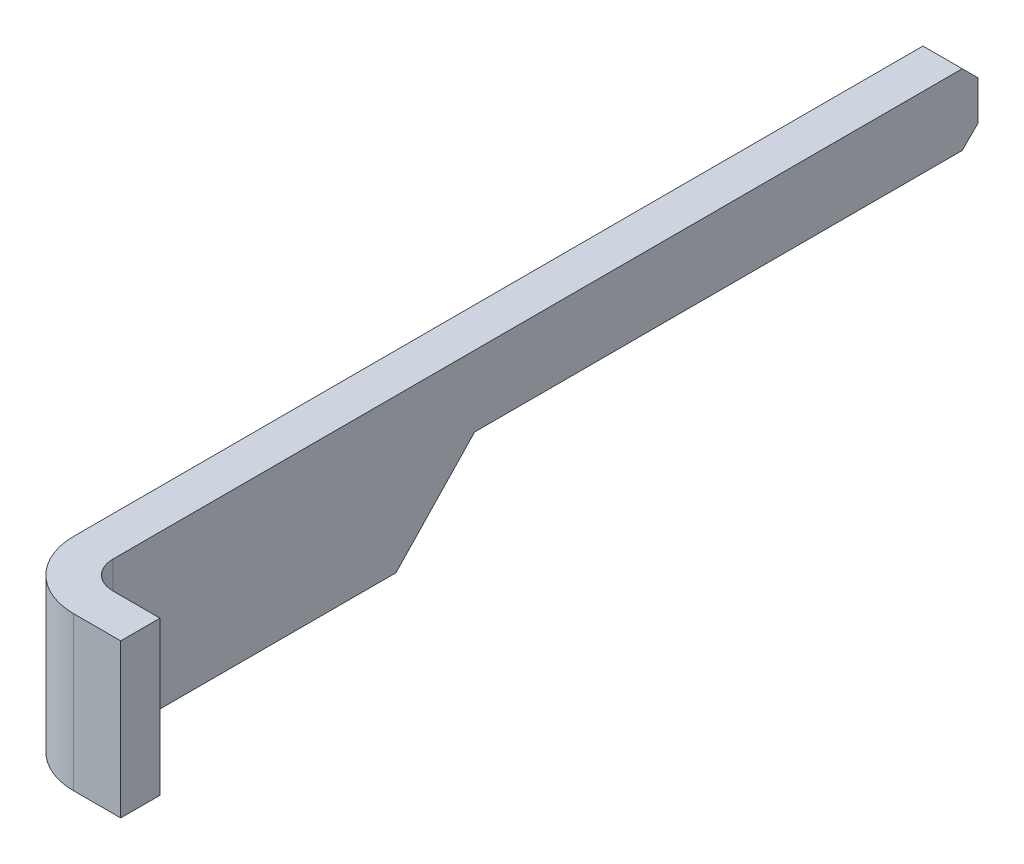
ISO-10303-21;
HEADER;
FILE_DESCRIPTION(('STEP AP214'),'2;1');
FILE_NAME('part.step','',(''),(''),'','','');
FILE_SCHEMA(('AUTOMOTIVE_DESIGN { 1 0 10303 214 1 1 1 1 }'));
ENDSEC;
DATA;
#1=APPLICATION_CONTEXT('core data for automotive mechanical design processes');
#2=APPLICATION_PROTOCOL_DEFINITION('international standard','automotive_design',2000,#1);
#3=PRODUCT_CONTEXT('',#1,'mechanical');
#4=PRODUCT('Part','Part','',(#3));
#5=PRODUCT_RELATED_PRODUCT_CATEGORY('part','',(#4));
#6=PRODUCT_DEFINITION_FORMATION('','',#4);
#7=PRODUCT_DEFINITION_CONTEXT('part definition',#1,'design');
#8=PRODUCT_DEFINITION('design','',#6,#7);
#9=PRODUCT_DEFINITION_SHAPE('','',#8);
#10=(LENGTH_UNIT() NAMED_UNIT(*) SI_UNIT(.MILLI.,.METRE.));
#11=(NAMED_UNIT(*) PLANE_ANGLE_UNIT() SI_UNIT($,.RADIAN.));
#12=(NAMED_UNIT(*) SI_UNIT($,.STERADIAN.) SOLID_ANGLE_UNIT());
#13=UNCERTAINTY_MEASURE_WITH_UNIT(LENGTH_MEASURE(1.E-05),#10,'distance_accuracy_value','');
#14=(GEOMETRIC_REPRESENTATION_CONTEXT(3) GLOBAL_UNCERTAINTY_ASSIGNED_CONTEXT((#13)) GLOBAL_UNIT_ASSIGNED_CONTEXT((#10,
#11,#12)) REPRESENTATION_CONTEXT('',''));
#15=CARTESIAN_POINT('',(0.,0.,0.));
#16=DIRECTION('',(0.,0.,1.));
#17=DIRECTION('',(1.,0.,0.));
#18=AXIS2_PLACEMENT_3D('',#15,#16,#17);
#19=CARTESIAN_POINT('',(-3.925,4.54308339506894,2.3));
#20=DIRECTION('',(-1.,0.,0.));
#21=DIRECTION('',(0.,1.,0.));
#22=AXIS2_PLACEMENT_3D('',#19,#20,#21);
#23=PLANE('',#22);
#24=DIRECTION('',(0.,0.,-1.));
#25=VECTOR('',#24,1.);
#26=CARTESIAN_POINT('',(-3.925,4.01808339506894,0.));
#27=LINE('',#26,#25);
#28=CARTESIAN_POINT('',(-3.925,4.01808339506894,2.3));
#29=VERTEX_POINT('',#28);
#30=CARTESIAN_POINT('',(-3.925,4.01808339506894,-3.1));
#31=VERTEX_POINT('',#30);
#32=EDGE_CURVE('E11',#29,#31,#27,.T.);
#33=ORIENTED_EDGE('',*,*,#32,.T.);
#34=DIRECTION('',(0.,-0.707106781186546,-0.707106781186549));
#35=VECTOR('',#34,1.);
#36=CARTESIAN_POINT('',(-3.925,4.01808339506894,-3.1));
#37=LINE('',#36,#35);
#38=CARTESIAN_POINT('',(-3.925,3.91808339506894,-3.2));
#39=VERTEX_POINT('',#38);
#40=EDGE_CURVE('E24',#31,#39,#37,.T.);
#41=ORIENTED_EDGE('',*,*,#40,.T.);
#42=DIRECTION('',(0.,-1.,0.));
#43=VECTOR('',#42,1.);
#44=CARTESIAN_POINT('',(-3.925,4.54308339506894,-3.2));
#45=LINE('',#44,#43);
#46=CARTESIAN_POINT('',(-3.925,3.66808339506894,-3.2));
#47=VERTEX_POINT('',#46);
#48=EDGE_CURVE('E186',#39,#47,#45,.T.);
#49=ORIENTED_EDGE('',*,*,#48,.T.);
#50=DIRECTION('',(0.,-0.707106781186548,0.707106781186548));
#51=VECTOR('',#50,1.);
#52=CARTESIAN_POINT('',(-3.925,3.66808339506894,-3.2));
#53=LINE('',#52,#51);
#54=CARTESIAN_POINT('',(-3.925,3.56808339506894,-3.1));
#55=VERTEX_POINT('',#54);
#56=EDGE_CURVE('E184',#47,#55,#53,.T.);
#57=ORIENTED_EDGE('',*,*,#56,.T.);
#58=DIRECTION('',(0.,0.,1.));
#59=VECTOR('',#58,1.);
#60=CARTESIAN_POINT('',(-3.925,3.56808339506894,0.));
#61=LINE('',#60,#59);
#62=CARTESIAN_POINT('',(-3.925,3.56808339506894,0.));
#63=VERTEX_POINT('',#62);
#64=EDGE_CURVE('E182',#55,#63,#61,.T.);
#65=ORIENTED_EDGE('',*,*,#64,.T.);
#66=DIRECTION('',(0.,-0.724137931034481,0.689655172413795));
#67=VECTOR('',#66,1.);
#68=CARTESIAN_POINT('',(-3.925,3.56808339506894,0.));
#69=LINE('',#68,#67);
#70=CARTESIAN_POINT('',(-3.925,3.04308339506894,0.5));
#71=VERTEX_POINT('',#70);
#72=EDGE_CURVE('E180',#63,#71,#69,.T.);
#73=ORIENTED_EDGE('',*,*,#72,.T.);
#74=DIRECTION('',(0.,0.,-1.));
#75=VECTOR('',#74,1.);
#76=CARTESIAN_POINT('',(-3.925,3.04308339506894,2.3));
#77=LINE('',#76,#75);
#78=CARTESIAN_POINT('',(-3.925,3.04308339506894,2.3));
#79=VERTEX_POINT('',#78);
#80=EDGE_CURVE('E177',#79,#71,#77,.T.);
#81=ORIENTED_EDGE('',*,*,#80,.F.);
#82=DIRECTION('',(0.,-1.,0.));
#83=VECTOR('',#82,1.);
#84=CARTESIAN_POINT('',(-3.925,4.54308339506894,2.3));
#85=LINE('',#84,#83);
#86=EDGE_CURVE('E174',#29,#79,#85,.T.);
#87=ORIENTED_EDGE('',*,*,#86,.F.);
#88=EDGE_LOOP('',(#33,#41,#49,#57,#65,#73,#81,#87));
#89=FACE_BOUND('',#88,.T.);
#90=ADVANCED_FACE('F17',(#89),#23,.T.);
#91=CARTESIAN_POINT('',(-3.675,4.54308339506894,2.3));
#92=DIRECTION('',(1.,0.,0.));
#93=DIRECTION('',(0.,0.,1.));
#94=AXIS2_PLACEMENT_3D('',#91,#92,#93);
#95=PLANE('',#94);
#96=DIRECTION('',(0.,1.,0.));
#97=VECTOR('',#96,1.);
#98=CARTESIAN_POINT('',(-3.675,4.54308339506894,2.3));
#99=LINE('',#98,#97);
#100=CARTESIAN_POINT('',(-3.675,3.04308339506894,2.3));
#101=VERTEX_POINT('',#100);
#102=CARTESIAN_POINT('',(-3.675,4.01808339506894,2.3));
#103=VERTEX_POINT('',#102);
#104=EDGE_CURVE('E172',#101,#103,#99,.T.);
#105=ORIENTED_EDGE('',*,*,#104,.F.);
#106=DIRECTION('',(0.,0.,-1.));
#107=VECTOR('',#106,1.);
#108=CARTESIAN_POINT('',(-3.675,3.04308339506894,2.3));
#109=LINE('',#108,#107);
#110=CARTESIAN_POINT('',(-3.675,3.04308339506894,0.5));
#111=VERTEX_POINT('',#110);
#112=EDGE_CURVE('E170',#101,#111,#109,.T.);
#113=ORIENTED_EDGE('',*,*,#112,.T.);
#114=DIRECTION('',(0.,0.724137931034481,-0.689655172413795));
#115=VECTOR('',#114,1.);
#116=CARTESIAN_POINT('',(-3.675,2.93071716439117,0.607015457788352));
#117=LINE('',#116,#115);
#118=CARTESIAN_POINT('',(-3.675,3.56808339506894,0.));
#119=VERTEX_POINT('',#118);
#120=EDGE_CURVE('E168',#111,#119,#117,.T.);
#121=ORIENTED_EDGE('',*,*,#120,.T.);
#122=DIRECTION('',(0.,0.,-1.));
#123=VECTOR('',#122,1.);
#124=CARTESIAN_POINT('',(-3.675,3.56808339506894,2.3));
#125=LINE('',#124,#123);
#126=CARTESIAN_POINT('',(-3.675,3.56808339506894,-3.1));
#127=VERTEX_POINT('',#126);
#128=EDGE_CURVE('E166',#119,#127,#125,.T.);
#129=ORIENTED_EDGE('',*,*,#128,.T.);
#130=DIRECTION('',(0.,0.707106781186548,-0.707106781186548));
#131=VECTOR('',#130,1.);
#132=CARTESIAN_POINT('',(-3.675,1.35558339506894,-0.887500000000001));
#133=LINE('',#132,#131);
#134=CARTESIAN_POINT('',(-3.675,3.66808339506894,-3.2));
#135=VERTEX_POINT('',#134);
#136=EDGE_CURVE('E164',#127,#135,#133,.T.);
#137=ORIENTED_EDGE('',*,*,#136,.T.);
#138=DIRECTION('',(0.,1.,0.));
#139=VECTOR('',#138,1.);
#140=CARTESIAN_POINT('',(-3.675,4.54308339506894,-3.2));
#141=LINE('',#140,#139);
#142=CARTESIAN_POINT('',(-3.675,3.91808339506894,-3.2));
#143=VERTEX_POINT('',#142);
#144=EDGE_CURVE('E162',#135,#143,#141,.T.);
#145=ORIENTED_EDGE('',*,*,#144,.T.);
#146=DIRECTION('',(0.,0.707106781186546,0.707106781186549));
#147=VECTOR('',#146,1.);
#148=CARTESIAN_POINT('',(-3.675,6.98058339506894,-0.137499999999986));
#149=LINE('',#148,#147);
#150=CARTESIAN_POINT('',(-3.675,4.01808339506894,-3.1));
#151=VERTEX_POINT('',#150);
#152=EDGE_CURVE('E160',#143,#151,#149,.T.);
#153=ORIENTED_EDGE('',*,*,#152,.T.);
#154=DIRECTION('',(0.,0.,1.));
#155=VECTOR('',#154,1.);
#156=CARTESIAN_POINT('',(-3.675,4.01808339506894,2.3));
#157=LINE('',#156,#155);
#158=EDGE_CURVE('E157',#151,#103,#157,.T.);
#159=ORIENTED_EDGE('',*,*,#158,.T.);
#160=EDGE_LOOP('',(#105,#113,#121,#129,#137,#145,#153,#159));
#161=FACE_BOUND('',#160,.T.);
#162=ADVANCED_FACE('F247',(#161),#95,.T.);
#163=CARTESIAN_POINT('',(-3.5,4.7,2.3));
#164=DIRECTION('',(0.,1.,0.));
#165=DIRECTION('',(0.,0.,1.));
#166=AXIS2_PLACEMENT_3D('',#163,#164,#165);
#167=CYLINDRICAL_SURFACE('',#166,0.425000000000003);
#168=ORIENTED_EDGE('',*,*,#86,.T.);
#169=CARTESIAN_POINT('',(-3.5,3.04308339506894,2.3));
#170=DIRECTION('',(0.,-1.,0.));
#171=DIRECTION('',(0.,0.,1.));
#172=AXIS2_PLACEMENT_3D('',#169,#170,#171);
#173=CIRCLE('',#172,0.425000000000002);
#174=CARTESIAN_POINT('',(-3.5,3.04308339506894,2.725));
#175=VERTEX_POINT('',#174);
#176=EDGE_CURVE('E154',#175,#79,#173,.T.);
#177=ORIENTED_EDGE('',*,*,#176,.F.);
#178=DIRECTION('',(0.,-1.,0.));
#179=VECTOR('',#178,1.);
#180=CARTESIAN_POINT('',(-3.5,4.54308339506894,2.725));
#181=LINE('',#180,#179);
#182=CARTESIAN_POINT('',(-3.5,4.01808339506894,2.725));
#183=VERTEX_POINT('',#182);
#184=EDGE_CURVE('E109',#183,#175,#181,.T.);
#185=ORIENTED_EDGE('',*,*,#184,.F.);
#186=CARTESIAN_POINT('',(-3.5,4.01808339506894,2.3));
#187=DIRECTION('',(0.,1.,0.));
#188=DIRECTION('',(0.,0.,1.));
#189=AXIS2_PLACEMENT_3D('',#186,#187,#188);
#190=CIRCLE('',#189,0.425000000000003);
#191=EDGE_CURVE('E151',#29,#183,#190,.T.);
#192=ORIENTED_EDGE('',*,*,#191,.F.);
#193=EDGE_LOOP('',(#168,#177,#185,#192));
#194=FACE_BOUND('',#193,.T.);
#195=ADVANCED_FACE('F230',(#194),#167,.T.);
#196=CARTESIAN_POINT('',(-3.5,4.7,2.3));
#197=DIRECTION('',(0.,1.,0.));
#198=DIRECTION('',(0.,0.,1.));
#199=AXIS2_PLACEMENT_3D('',#196,#197,#198);
#200=CYLINDRICAL_SURFACE('',#199,0.175000000000002);
#201=DIRECTION('',(0.,1.,0.));
#202=VECTOR('',#201,1.);
#203=CARTESIAN_POINT('',(-3.5,4.54308339506894,2.475));
#204=LINE('',#203,#202);
#205=CARTESIAN_POINT('',(-3.5,3.04308339506894,2.475));
#206=VERTEX_POINT('',#205);
#207=CARTESIAN_POINT('',(-3.5,4.01808339506894,2.475));
#208=VERTEX_POINT('',#207);
#209=EDGE_CURVE('E148',#206,#208,#204,.T.);
#210=ORIENTED_EDGE('',*,*,#209,.F.);
#211=CARTESIAN_POINT('',(-3.5,3.04308339506894,2.3));
#212=DIRECTION('',(0.,-1.,0.));
#213=DIRECTION('',(0.,0.,1.));
#214=AXIS2_PLACEMENT_3D('',#211,#212,#213);
#215=CIRCLE('',#214,0.175000000000002);
#216=EDGE_CURVE('E145',#206,#101,#215,.T.);
#217=ORIENTED_EDGE('',*,*,#216,.T.);
#218=ORIENTED_EDGE('',*,*,#104,.T.);
#219=CARTESIAN_POINT('',(-3.5,4.01808339506894,2.3));
#220=DIRECTION('',(0.,-1.,0.));
#221=DIRECTION('',(0.,0.,1.));
#222=AXIS2_PLACEMENT_3D('',#219,#220,#221);
#223=CIRCLE('',#222,0.175000000000002);
#224=EDGE_CURVE('E142',#208,#103,#223,.T.);
#225=ORIENTED_EDGE('',*,*,#224,.F.);
#226=EDGE_LOOP('',(#210,#217,#218,#225));
#227=FACE_BOUND('',#226,.T.);
#228=ADVANCED_FACE('F222',(#227),#200,.F.);
#229=CARTESIAN_POINT('',(-3.5,4.54308339506894,2.475));
#230=DIRECTION('',(0.,0.,1.));
#231=DIRECTION('',(-1.,0.,0.));
#232=AXIS2_PLACEMENT_3D('',#229,#230,#231);
#233=PLANE('',#232);
#234=DIRECTION('',(1.,0.,0.));
#235=VECTOR('',#234,1.);
#236=CARTESIAN_POINT('',(-3.5,4.01808339506894,2.475));
#237=LINE('',#236,#235);
#238=CARTESIAN_POINT('',(-3.2,4.01808339506894,2.475));
#239=VERTEX_POINT('',#238);
#240=EDGE_CURVE('E140',#208,#239,#237,.T.);
#241=ORIENTED_EDGE('',*,*,#240,.T.);
#242=DIRECTION('',(0.,1.,0.));
#243=VECTOR('',#242,1.);
#244=CARTESIAN_POINT('',(-3.2,4.54308339506894,2.475));
#245=LINE('',#244,#243);
#246=CARTESIAN_POINT('',(-3.2,3.04308339506894,2.475));
#247=VERTEX_POINT('',#246);
#248=EDGE_CURVE('E138',#247,#239,#245,.T.);
#249=ORIENTED_EDGE('',*,*,#248,.F.);
#250=DIRECTION('',(1.,0.,0.));
#251=VECTOR('',#250,1.);
#252=CARTESIAN_POINT('',(-3.5,3.04308339506894,2.475));
#253=LINE('',#252,#251);
#254=EDGE_CURVE('E127',#206,#247,#253,.T.);
#255=ORIENTED_EDGE('',*,*,#254,.F.);
#256=ORIENTED_EDGE('',*,*,#209,.T.);
#257=EDGE_LOOP('',(#241,#249,#255,#256));
#258=FACE_BOUND('',#257,.T.);
#259=ADVANCED_FACE('F225',(#258),#233,.F.);
#260=CARTESIAN_POINT('',(-3.5,4.54308339506894,2.725));
#261=DIRECTION('',(0.,0.,-1.));
#262=DIRECTION('',(0.,1.,0.));
#263=AXIS2_PLACEMENT_3D('',#260,#261,#262);
#264=PLANE('',#263);
#265=DIRECTION('',(-1.,0.,0.));
#266=VECTOR('',#265,1.);
#267=CARTESIAN_POINT('',(-3.5,4.01808339506894,2.725));
#268=LINE('',#267,#266);
#269=CARTESIAN_POINT('',(-3.2,4.01808339506894,2.725));
#270=VERTEX_POINT('',#269);
#271=EDGE_CURVE('E114',#270,#183,#268,.T.);
#272=ORIENTED_EDGE('',*,*,#271,.T.);
#273=ORIENTED_EDGE('',*,*,#184,.T.);
#274=DIRECTION('',(1.,0.,0.));
#275=VECTOR('',#274,1.);
#276=CARTESIAN_POINT('',(-3.5,3.04308339506894,2.725));
#277=LINE('',#276,#275);
#278=CARTESIAN_POINT('',(-3.2,3.04308339506894,2.725));
#279=VERTEX_POINT('',#278);
#280=EDGE_CURVE('E103',#175,#279,#277,.T.);
#281=ORIENTED_EDGE('',*,*,#280,.T.);
#282=DIRECTION('',(0.,-1.,0.));
#283=VECTOR('',#282,1.);
#284=CARTESIAN_POINT('',(-3.2,4.54308339506894,2.725));
#285=LINE('',#284,#283);
#286=EDGE_CURVE('E107',#270,#279,#285,.T.);
#287=ORIENTED_EDGE('',*,*,#286,.F.);
#288=EDGE_LOOP('',(#272,#273,#281,#287));
#289=FACE_BOUND('',#288,.T.);
#290=ADVANCED_FACE('F106',(#289),#264,.F.);
#291=CARTESIAN_POINT('',(-3.2,0.,0.));
#292=DIRECTION('',(-1.,0.,0.));
#293=DIRECTION('',(0.,0.,-1.));
#294=AXIS2_PLACEMENT_3D('',#291,#292,#293);
#295=PLANE('',#294);
#296=DIRECTION('',(0.,0.,1.));
#297=VECTOR('',#296,1.);
#298=CARTESIAN_POINT('',(-3.2,4.01808339506894,0.));
#299=LINE('',#298,#297);
#300=EDGE_CURVE('E122',#239,#270,#299,.T.);
#301=ORIENTED_EDGE('',*,*,#300,.T.);
#302=ORIENTED_EDGE('',*,*,#286,.T.);
#303=DIRECTION('',(0.,0.,-1.));
#304=VECTOR('',#303,1.);
#305=CARTESIAN_POINT('',(-3.2,3.04308339506894,2.725));
#306=LINE('',#305,#304);
#307=EDGE_CURVE('E120',#279,#247,#306,.T.);
#308=ORIENTED_EDGE('',*,*,#307,.T.);
#309=ORIENTED_EDGE('',*,*,#248,.T.);
#310=EDGE_LOOP('',(#301,#302,#308,#309));
#311=FACE_BOUND('',#310,.T.);
#312=ADVANCED_FACE('F118',(#311),#295,.F.);
#313=CARTESIAN_POINT('',(-3.925,3.04308339506894,2.3));
#314=DIRECTION('',(0.,-1.,0.));
#315=DIRECTION('',(0.,0.,-1.));
#316=AXIS2_PLACEMENT_3D('',#313,#314,#315);
#317=PLANE('',#316);
#318=DIRECTION('',(-1.,0.,0.));
#319=VECTOR('',#318,1.);
#320=CARTESIAN_POINT('',(-3.425,3.04308339506894,0.5));
#321=LINE('',#320,#319);
#322=EDGE_CURVE('E128',#111,#71,#321,.T.);
#323=ORIENTED_EDGE('',*,*,#322,.F.);
#324=ORIENTED_EDGE('',*,*,#112,.F.);
#325=DIRECTION('',(1.,0.,0.));
#326=VECTOR('',#325,1.);
#327=CARTESIAN_POINT('',(-3.925,3.04308339506894,2.3));
#328=LINE('',#327,#326);
#329=EDGE_CURVE('E132',#79,#101,#328,.T.);
#330=ORIENTED_EDGE('',*,*,#329,.F.);
#331=ORIENTED_EDGE('',*,*,#80,.T.);
#332=EDGE_LOOP('',(#323,#324,#330,#331));
#333=FACE_BOUND('',#332,.T.);
#334=ADVANCED_FACE('F218',(#333),#317,.T.);
#335=CARTESIAN_POINT('',(-3.5,3.04308339506894,2.725));
#336=DIRECTION('',(0.,-1.,0.));
#337=DIRECTION('',(0.,0.,-1.));
#338=AXIS2_PLACEMENT_3D('',#335,#336,#337);
#339=PLANE('',#338);
#340=DIRECTION('',(0.,0.,-1.));
#341=VECTOR('',#340,1.);
#342=CARTESIAN_POINT('',(-3.5,3.04308339506894,2.725));
#343=LINE('',#342,#341);
#344=EDGE_CURVE('E204',#175,#206,#343,.T.);
#345=ORIENTED_EDGE('',*,*,#344,.F.);
#346=ORIENTED_EDGE('',*,*,#176,.T.);
#347=ORIENTED_EDGE('',*,*,#329,.T.);
#348=ORIENTED_EDGE('',*,*,#216,.F.);
#349=EDGE_LOOP('',(#345,#346,#347,#348));
#350=FACE_BOUND('',#349,.T.);
#351=ADVANCED_FACE('F213',(#350),#339,.T.);
#352=CARTESIAN_POINT('',(-3.5,3.04308339506894,2.725));
#353=DIRECTION('',(0.,1.,0.));
#354=DIRECTION('',(0.,0.,1.));
#355=AXIS2_PLACEMENT_3D('',#352,#353,#354);
#356=PLANE('',#355);
#357=ORIENTED_EDGE('',*,*,#307,.F.);
#358=ORIENTED_EDGE('',*,*,#280,.F.);
#359=ORIENTED_EDGE('',*,*,#344,.T.);
#360=ORIENTED_EDGE('',*,*,#254,.T.);
#361=EDGE_LOOP('',(#357,#358,#359,#360));
#362=FACE_BOUND('',#361,.T.);
#363=ADVANCED_FACE('F125',(#362),#356,.F.);
#364=CARTESIAN_POINT('',(-1.2,0.,-3.2));
#365=DIRECTION('',(0.,0.,-1.));
#366=DIRECTION('',(1.,0.,0.));
#367=AXIS2_PLACEMENT_3D('',#364,#365,#366);
#368=PLANE('',#367);
#369=DIRECTION('',(-1.,0.,0.));
#370=VECTOR('',#369,1.);
#371=CARTESIAN_POINT('',(-1.19999999999999,3.66808339506894,-3.2));
#372=LINE('',#371,#370);
#373=EDGE_CURVE('E199',#135,#47,#372,.T.);
#374=ORIENTED_EDGE('',*,*,#373,.T.);
#375=ORIENTED_EDGE('',*,*,#48,.F.);
#376=DIRECTION('',(1.,0.,0.));
#377=VECTOR('',#376,1.);
#378=CARTESIAN_POINT('',(-1.20000000000001,3.91808339506894,-3.2));
#379=LINE('',#378,#377);
#380=EDGE_CURVE('E197',#39,#143,#379,.T.);
#381=ORIENTED_EDGE('',*,*,#380,.T.);
#382=ORIENTED_EDGE('',*,*,#144,.F.);
#383=EDGE_LOOP('',(#374,#375,#381,#382));
#384=FACE_BOUND('',#383,.T.);
#385=ADVANCED_FACE('F195',(#384),#368,.T.);
#386=CARTESIAN_POINT('',(-3.425,4.01808339506894,-3.1));
#387=DIRECTION('',(0.,-0.707106781186549,0.707106781186546));
#388=DIRECTION('',(0.,-0.707106781186546,-0.707106781186549));
#389=AXIS2_PLACEMENT_3D('',#386,#387,#388);
#390=PLANE('',#389);
#391=ORIENTED_EDGE('',*,*,#152,.F.);
#392=ORIENTED_EDGE('',*,*,#380,.F.);
#393=ORIENTED_EDGE('',*,*,#40,.F.);
#394=DIRECTION('',(-1.,0.,0.));
#395=VECTOR('',#394,1.);
#396=CARTESIAN_POINT('',(-3.425,4.01808339506894,-3.1));
#397=LINE('',#396,#395);
#398=EDGE_CURVE('E202',#151,#31,#397,.T.);
#399=ORIENTED_EDGE('',*,*,#398,.F.);
#400=EDGE_LOOP('',(#391,#392,#393,#399));
#401=FACE_BOUND('',#400,.T.);
#402=ADVANCED_FACE('F201',(#401),#390,.F.);
#403=CARTESIAN_POINT('',(-3.425,4.01808339506894,0.));
#404=DIRECTION('',(0.,-1.,0.));
#405=DIRECTION('',(0.,0.,-1.));
#406=AXIS2_PLACEMENT_3D('',#403,#404,#405);
#407=PLANE('',#406);
#408=ORIENTED_EDGE('',*,*,#158,.F.);
#409=ORIENTED_EDGE('',*,*,#398,.T.);
#410=ORIENTED_EDGE('',*,*,#32,.F.);
#411=ORIENTED_EDGE('',*,*,#191,.T.);
#412=ORIENTED_EDGE('',*,*,#271,.F.);
#413=ORIENTED_EDGE('',*,*,#300,.F.);
#414=ORIENTED_EDGE('',*,*,#240,.F.);
#415=ORIENTED_EDGE('',*,*,#224,.T.);
#416=EDGE_LOOP('',(#408,#409,#410,#411,#412,#413,#414,#415));
#417=FACE_BOUND('',#416,.T.);
#418=ADVANCED_FACE('F227',(#417),#407,.F.);
#419=CARTESIAN_POINT('',(-3.425,3.56808339506894,0.));
#420=DIRECTION('',(0.,0.689655172413795,0.724137931034481));
#421=DIRECTION('',(0.,-0.724137931034481,0.689655172413795));
#422=AXIS2_PLACEMENT_3D('',#419,#420,#421);
#423=PLANE('',#422);
#424=ORIENTED_EDGE('',*,*,#120,.F.);
#425=ORIENTED_EDGE('',*,*,#322,.T.);
#426=ORIENTED_EDGE('',*,*,#72,.F.);
#427=DIRECTION('',(-1.,0.,0.));
#428=VECTOR('',#427,1.);
#429=CARTESIAN_POINT('',(-3.425,3.56808339506894,0.));
#430=LINE('',#429,#428);
#431=EDGE_CURVE('E206',#119,#63,#430,.T.);
#432=ORIENTED_EDGE('',*,*,#431,.F.);
#433=EDGE_LOOP('',(#424,#425,#426,#432));
#434=FACE_BOUND('',#433,.T.);
#435=ADVANCED_FACE('F236',(#434),#423,.F.);
#436=CARTESIAN_POINT('',(-3.425,3.56808339506894,0.));
#437=DIRECTION('',(0.,1.,0.));
#438=DIRECTION('',(0.,0.,1.));
#439=AXIS2_PLACEMENT_3D('',#436,#437,#438);
#440=PLANE('',#439);
#441=ORIENTED_EDGE('',*,*,#128,.F.);
#442=ORIENTED_EDGE('',*,*,#431,.T.);
#443=ORIENTED_EDGE('',*,*,#64,.F.);
#444=DIRECTION('',(-1.,0.,0.));
#445=VECTOR('',#444,1.);
#446=CARTESIAN_POINT('',(-3.425,3.56808339506894,-3.1));
#447=LINE('',#446,#445);
#448=EDGE_CURVE('E242',#127,#55,#447,.T.);
#449=ORIENTED_EDGE('',*,*,#448,.F.);
#450=EDGE_LOOP('',(#441,#442,#443,#449));
#451=FACE_BOUND('',#450,.T.);
#452=ADVANCED_FACE('F239',(#451),#440,.F.);
#453=CARTESIAN_POINT('',(-3.425,3.66808339506894,-3.2));
#454=DIRECTION('',(0.,0.707106781186548,0.707106781186548));
#455=DIRECTION('',(0.,-0.707106781186548,0.707106781186548));
#456=AXIS2_PLACEMENT_3D('',#453,#454,#455);
#457=PLANE('',#456);
#458=ORIENTED_EDGE('',*,*,#136,.F.);
#459=ORIENTED_EDGE('',*,*,#448,.T.);
#460=ORIENTED_EDGE('',*,*,#56,.F.);
#461=ORIENTED_EDGE('',*,*,#373,.F.);
#462=EDGE_LOOP('',(#458,#459,#460,#461));
#463=FACE_BOUND('',#462,.T.);
#464=ADVANCED_FACE('F246',(#463),#457,.F.);
#465=CLOSED_SHELL('',(#90,#162,#195,#228,#259,#290,#312,#334,#351,#363,#385,#402,#418,#435,#452,#464));
#466=MANIFOLD_SOLID_BREP('B1',#465);
#467=ADVANCED_BREP_SHAPE_REPRESENTATION('',(#18,#466),#14);
#468=SHAPE_DEFINITION_REPRESENTATION(#9,#467);
ENDSEC;
END-ISO-10303-21;
